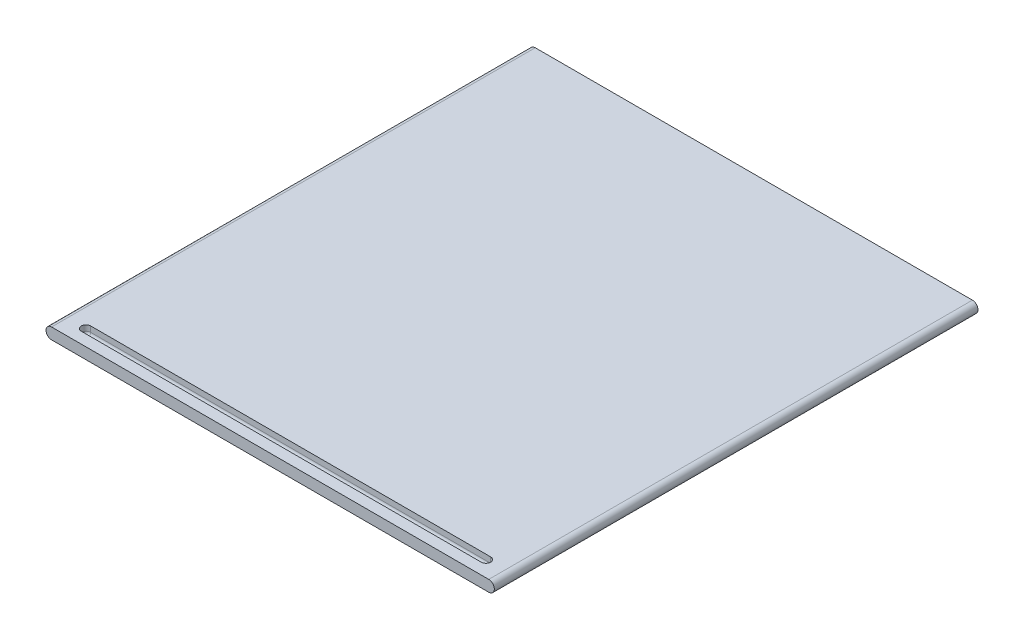
ISO-10303-21;
HEADER;
FILE_DESCRIPTION(('STEP AP214'),'2;1');
FILE_NAME('part.step','',(''),(''),'','','');
FILE_SCHEMA(('AUTOMOTIVE_DESIGN { 1 0 10303 214 1 1 1 1 }'));
ENDSEC;
DATA;
#1=APPLICATION_CONTEXT('core data for automotive mechanical design processes');
#2=APPLICATION_PROTOCOL_DEFINITION('international standard','automotive_design',2000,#1);
#3=PRODUCT_CONTEXT('',#1,'mechanical');
#4=PRODUCT('Part','Part','',(#3));
#5=PRODUCT_RELATED_PRODUCT_CATEGORY('part','',(#4));
#6=PRODUCT_DEFINITION_FORMATION('','',#4);
#7=PRODUCT_DEFINITION_CONTEXT('part definition',#1,'design');
#8=PRODUCT_DEFINITION('design','',#6,#7);
#9=PRODUCT_DEFINITION_SHAPE('','',#8);
#10=(LENGTH_UNIT() NAMED_UNIT(*) SI_UNIT(.MILLI.,.METRE.));
#11=(NAMED_UNIT(*) PLANE_ANGLE_UNIT() SI_UNIT($,.RADIAN.));
#12=(NAMED_UNIT(*) SI_UNIT($,.STERADIAN.) SOLID_ANGLE_UNIT());
#13=UNCERTAINTY_MEASURE_WITH_UNIT(LENGTH_MEASURE(1.E-05),#10,'distance_accuracy_value','');
#14=(GEOMETRIC_REPRESENTATION_CONTEXT(3) GLOBAL_UNCERTAINTY_ASSIGNED_CONTEXT((#13)) GLOBAL_UNIT_ASSIGNED_CONTEXT((#10,
#11,#12)) REPRESENTATION_CONTEXT('',''));
#15=CARTESIAN_POINT('',(0.,0.,0.));
#16=DIRECTION('',(0.,0.,1.));
#17=DIRECTION('',(1.,0.,0.));
#18=AXIS2_PLACEMENT_3D('',#15,#16,#17);
#19=CARTESIAN_POINT('',(-23.5,0.,52.));
#20=DIRECTION('',(0.,0.,-1.));
#21=DIRECTION('',(-1.,0.,0.));
#22=AXIS2_PLACEMENT_3D('',#19,#20,#21);
#23=CYLINDRICAL_SURFACE('',#22,0.6);
#24=CARTESIAN_POINT('',(-23.5,0.,0.));
#25=DIRECTION('',(0.,0.,1.));
#26=DIRECTION('',(1.,0.,0.));
#27=AXIS2_PLACEMENT_3D('',#24,#25,#26);
#28=CIRCLE('',#27,0.6);
#29=CARTESIAN_POINT('',(-23.5,0.6,0.));
#30=VERTEX_POINT('',#29);
#31=CARTESIAN_POINT('',(-23.5,-0.6,0.));
#32=VERTEX_POINT('',#31);
#33=EDGE_CURVE('E149',#30,#32,#28,.T.);
#34=ORIENTED_EDGE('',*,*,#33,.T.);
#35=DIRECTION('',(0.,0.,-1.));
#36=VECTOR('',#35,1.);
#37=CARTESIAN_POINT('',(-23.5,-0.6,52.));
#38=LINE('',#37,#36);
#39=CARTESIAN_POINT('',(-23.5,-0.6,52.));
#40=VERTEX_POINT('',#39);
#41=EDGE_CURVE('E178',#40,#32,#38,.T.);
#42=ORIENTED_EDGE('',*,*,#41,.F.);
#43=CARTESIAN_POINT('',(-23.5,0.,52.));
#44=DIRECTION('',(0.,0.,1.));
#45=DIRECTION('',(1.,0.,0.));
#46=AXIS2_PLACEMENT_3D('',#43,#44,#45);
#47=CIRCLE('',#46,0.6);
#48=CARTESIAN_POINT('',(-23.5,0.6,52.));
#49=VERTEX_POINT('',#48);
#50=EDGE_CURVE('E152',#49,#40,#47,.T.);
#51=ORIENTED_EDGE('',*,*,#50,.F.);
#52=DIRECTION('',(0.,0.,-1.));
#53=VECTOR('',#52,1.);
#54=CARTESIAN_POINT('',(-23.5,0.6,52.));
#55=LINE('',#54,#53);
#56=EDGE_CURVE('E162',#49,#30,#55,.T.);
#57=ORIENTED_EDGE('',*,*,#56,.T.);
#58=EDGE_LOOP('',(#34,#42,#51,#57));
#59=FACE_BOUND('',#58,.T.);
#60=ADVANCED_FACE('F41',(#59),#23,.T.);
#61=CARTESIAN_POINT('',(-23.5,-0.6,52.));
#62=DIRECTION('',(0.,1.,0.));
#63=DIRECTION('',(-1.,0.,0.));
#64=AXIS2_PLACEMENT_3D('',#61,#62,#63);
#65=PLANE('',#64);
#66=DIRECTION('',(1.,0.,0.));
#67=VECTOR('',#66,1.);
#68=CARTESIAN_POINT('',(-23.5,-0.6,0.));
#69=LINE('',#68,#67);
#70=CARTESIAN_POINT('',(23.5,-0.599999999999991,0.));
#71=VERTEX_POINT('',#70);
#72=EDGE_CURVE('E165',#32,#71,#69,.T.);
#73=ORIENTED_EDGE('',*,*,#72,.T.);
#74=DIRECTION('',(0.,0.,-1.));
#75=VECTOR('',#74,1.);
#76=CARTESIAN_POINT('',(23.5,-0.599999999999991,52.));
#77=LINE('',#76,#75);
#78=CARTESIAN_POINT('',(23.5,-0.599999999999991,52.));
#79=VERTEX_POINT('',#78);
#80=EDGE_CURVE('E175',#79,#71,#77,.T.);
#81=ORIENTED_EDGE('',*,*,#80,.F.);
#82=DIRECTION('',(1.,0.,0.));
#83=VECTOR('',#82,1.);
#84=CARTESIAN_POINT('',(-23.5,-0.6,52.));
#85=LINE('',#84,#83);
#86=EDGE_CURVE('E155',#40,#79,#85,.T.);
#87=ORIENTED_EDGE('',*,*,#86,.F.);
#88=ORIENTED_EDGE('',*,*,#41,.T.);
#89=EDGE_LOOP('',(#73,#81,#87,#88));
#90=FACE_BOUND('',#89,.T.);
#91=ADVANCED_FACE('F227',(#90),#65,.F.);
#92=CARTESIAN_POINT('',(23.5,0.,52.));
#93=DIRECTION('',(0.,0.,-1.));
#94=DIRECTION('',(-1.,0.,0.));
#95=AXIS2_PLACEMENT_3D('',#92,#93,#94);
#96=CYLINDRICAL_SURFACE('',#95,0.6);
#97=CARTESIAN_POINT('',(23.5,0.,0.));
#98=DIRECTION('',(0.,0.,1.));
#99=DIRECTION('',(1.,0.,0.));
#100=AXIS2_PLACEMENT_3D('',#97,#98,#99);
#101=CIRCLE('',#100,0.6);
#102=CARTESIAN_POINT('',(23.5,0.600000000000009,0.));
#103=VERTEX_POINT('',#102);
#104=EDGE_CURVE('E167',#71,#103,#101,.T.);
#105=ORIENTED_EDGE('',*,*,#104,.T.);
#106=DIRECTION('',(0.,0.,-1.));
#107=VECTOR('',#106,1.);
#108=CARTESIAN_POINT('',(23.5,0.600000000000009,52.));
#109=LINE('',#108,#107);
#110=CARTESIAN_POINT('',(23.5,0.600000000000009,52.));
#111=VERTEX_POINT('',#110);
#112=EDGE_CURVE('E172',#111,#103,#109,.T.);
#113=ORIENTED_EDGE('',*,*,#112,.F.);
#114=CARTESIAN_POINT('',(23.5,0.,52.));
#115=DIRECTION('',(0.,0.,1.));
#116=DIRECTION('',(1.,0.,0.));
#117=AXIS2_PLACEMENT_3D('',#114,#115,#116);
#118=CIRCLE('',#117,0.6);
#119=EDGE_CURVE('E158',#79,#111,#118,.T.);
#120=ORIENTED_EDGE('',*,*,#119,.F.);
#121=ORIENTED_EDGE('',*,*,#80,.T.);
#122=EDGE_LOOP('',(#105,#113,#120,#121));
#123=FACE_BOUND('',#122,.T.);
#124=ADVANCED_FACE('F233',(#123),#96,.T.);
#125=CARTESIAN_POINT('',(-23.5,0.6,52.));
#126=DIRECTION('',(0.,-1.,0.));
#127=DIRECTION('',(1.,0.,0.));
#128=AXIS2_PLACEMENT_3D('',#125,#126,#127);
#129=PLANE('',#128);
#130=DIRECTION('',(1.,0.,0.));
#131=VECTOR('',#130,1.);
#132=CARTESIAN_POINT('',(-21.5,0.600000000000001,50.8));
#133=LINE('',#132,#131);
#134=CARTESIAN_POINT('',(-21.5,0.6,50.8));
#135=VERTEX_POINT('',#134);
#136=CARTESIAN_POINT('',(21.5,0.600000000000008,50.8));
#137=VERTEX_POINT('',#136);
#138=EDGE_CURVE('E132',#135,#137,#133,.T.);
#139=ORIENTED_EDGE('',*,*,#138,.F.);
#140=CARTESIAN_POINT('',(-21.5,0.600000000000001,50.3));
#141=DIRECTION('',(0.,1.,0.));
#142=DIRECTION('',(-1.,0.,0.));
#143=AXIS2_PLACEMENT_3D('',#140,#141,#142);
#144=CIRCLE('',#143,0.499999999999994);
#145=CARTESIAN_POINT('',(-21.5,0.600000000000001,49.8));
#146=VERTEX_POINT('',#145);
#147=EDGE_CURVE('E137',#146,#135,#144,.T.);
#148=ORIENTED_EDGE('',*,*,#147,.F.);
#149=DIRECTION('',(-1.,0.,0.));
#150=VECTOR('',#149,1.);
#151=CARTESIAN_POINT('',(-21.5,0.600000000000001,49.8));
#152=LINE('',#151,#150);
#153=CARTESIAN_POINT('',(21.5,0.600000000000008,49.8));
#154=VERTEX_POINT('',#153);
#155=EDGE_CURVE('E142',#154,#146,#152,.T.);
#156=ORIENTED_EDGE('',*,*,#155,.F.);
#157=CARTESIAN_POINT('',(21.5,0.600000000000008,50.3));
#158=DIRECTION('',(0.,1.,0.));
#159=DIRECTION('',(-1.,0.,0.));
#160=AXIS2_PLACEMENT_3D('',#157,#158,#159);
#161=CIRCLE('',#160,0.5);
#162=EDGE_CURVE('E124',#137,#154,#161,.T.);
#163=ORIENTED_EDGE('',*,*,#162,.F.);
#164=EDGE_LOOP('',(#139,#148,#156,#163));
#165=FACE_BOUND('',#164,.T.);
#166=DIRECTION('',(-1.,0.,0.));
#167=VECTOR('',#166,1.);
#168=CARTESIAN_POINT('',(-23.5,0.6,0.));
#169=LINE('',#168,#167);
#170=EDGE_CURVE('E156',#103,#30,#169,.T.);
#171=ORIENTED_EDGE('',*,*,#170,.T.);
#172=ORIENTED_EDGE('',*,*,#56,.F.);
#173=DIRECTION('',(-1.,0.,0.));
#174=VECTOR('',#173,1.);
#175=CARTESIAN_POINT('',(-23.5,0.6,52.));
#176=LINE('',#175,#174);
#177=EDGE_CURVE('E160',#111,#49,#176,.T.);
#178=ORIENTED_EDGE('',*,*,#177,.F.);
#179=ORIENTED_EDGE('',*,*,#112,.T.);
#180=EDGE_LOOP('',(#171,#172,#178,#179));
#181=FACE_BOUND('',#180,.T.);
#182=ADVANCED_FACE('F139',(#165,#181),#129,.F.);
#183=CARTESIAN_POINT('',(-23.5,0.,52.));
#184=DIRECTION('',(0.,0.,1.));
#185=DIRECTION('',(1.,0.,0.));
#186=AXIS2_PLACEMENT_3D('',#183,#184,#185);
#187=PLANE('',#186);
#188=ORIENTED_EDGE('',*,*,#50,.T.);
#189=ORIENTED_EDGE('',*,*,#86,.T.);
#190=ORIENTED_EDGE('',*,*,#119,.T.);
#191=ORIENTED_EDGE('',*,*,#177,.T.);
#192=EDGE_LOOP('',(#188,#189,#190,#191));
#193=FACE_BOUND('',#192,.T.);
#194=ADVANCED_FACE('F308',(#193),#187,.T.);
#195=CARTESIAN_POINT('',(-23.5,0.,0.));
#196=DIRECTION('',(0.,0.,1.));
#197=DIRECTION('',(1.,0.,0.));
#198=AXIS2_PLACEMENT_3D('',#195,#196,#197);
#199=PLANE('',#198);
#200=ORIENTED_EDGE('',*,*,#33,.F.);
#201=ORIENTED_EDGE('',*,*,#170,.F.);
#202=ORIENTED_EDGE('',*,*,#104,.F.);
#203=ORIENTED_EDGE('',*,*,#72,.F.);
#204=EDGE_LOOP('',(#200,#201,#202,#203));
#205=FACE_BOUND('',#204,.T.);
#206=ADVANCED_FACE('F298',(#205),#199,.F.);
#207=CARTESIAN_POINT('',(-21.5,-0.4,50.3));
#208=DIRECTION('',(0.,1.,0.));
#209=DIRECTION('',(-1.,0.,0.));
#210=AXIS2_PLACEMENT_3D('',#207,#208,#209);
#211=CYLINDRICAL_SURFACE('',#210,0.499999999999994);
#212=DIRECTION('',(0.,1.,0.));
#213=VECTOR('',#212,1.);
#214=CARTESIAN_POINT('',(-21.5,-0.4,50.8));
#215=LINE('',#214,#213);
#216=CARTESIAN_POINT('',(-21.5,0.,50.8));
#217=VERTEX_POINT('',#216);
#218=EDGE_CURVE('E129',#217,#135,#215,.T.);
#219=ORIENTED_EDGE('',*,*,#218,.F.);
#220=CARTESIAN_POINT('',(-21.5,0.,50.3));
#221=DIRECTION('',(0.,1.,0.));
#222=DIRECTION('',(-1.,0.,0.));
#223=AXIS2_PLACEMENT_3D('',#220,#221,#222);
#224=CIRCLE('',#223,0.499999999999994);
#225=CARTESIAN_POINT('',(-21.5,0.,49.8));
#226=VERTEX_POINT('',#225);
#227=EDGE_CURVE('E50',#217,#226,#224,.F.);
#228=ORIENTED_EDGE('',*,*,#227,.T.);
#229=DIRECTION('',(0.,1.,0.));
#230=VECTOR('',#229,1.);
#231=CARTESIAN_POINT('',(-21.5,-0.4,49.8));
#232=LINE('',#231,#230);
#233=EDGE_CURVE('E147',#226,#146,#232,.T.);
#234=ORIENTED_EDGE('',*,*,#233,.T.);
#235=ORIENTED_EDGE('',*,*,#147,.T.);
#236=EDGE_LOOP('',(#219,#228,#234,#235));
#237=FACE_BOUND('',#236,.T.);
#238=ADVANCED_FACE('F206',(#237),#211,.F.);
#239=CARTESIAN_POINT('',(-21.5,-0.4,49.8));
#240=DIRECTION('',(0.,0.,-1.));
#241=DIRECTION('',(-1.,0.,0.));
#242=AXIS2_PLACEMENT_3D('',#239,#240,#241);
#243=PLANE('',#242);
#244=ORIENTED_EDGE('',*,*,#233,.F.);
#245=DIRECTION('',(-1.,0.,0.));
#246=VECTOR('',#245,1.);
#247=CARTESIAN_POINT('',(-21.5,0.,49.8));
#248=LINE('',#247,#246);
#249=CARTESIAN_POINT('',(21.5,0.,49.8));
#250=VERTEX_POINT('',#249);
#251=EDGE_CURVE('E11',#226,#250,#248,.F.);
#252=ORIENTED_EDGE('',*,*,#251,.T.);
#253=DIRECTION('',(0.,1.,0.));
#254=VECTOR('',#253,1.);
#255=CARTESIAN_POINT('',(21.5,-0.399999999999992,49.8));
#256=LINE('',#255,#254);
#257=EDGE_CURVE('E128',#250,#154,#256,.T.);
#258=ORIENTED_EDGE('',*,*,#257,.T.);
#259=ORIENTED_EDGE('',*,*,#155,.T.);
#260=EDGE_LOOP('',(#244,#252,#258,#259));
#261=FACE_BOUND('',#260,.T.);
#262=ADVANCED_FACE('F208',(#261),#243,.F.);
#263=CARTESIAN_POINT('',(21.5,-0.399999999999992,50.3));
#264=DIRECTION('',(0.,1.,0.));
#265=DIRECTION('',(-1.,0.,0.));
#266=AXIS2_PLACEMENT_3D('',#263,#264,#265);
#267=CYLINDRICAL_SURFACE('',#266,0.5);
#268=ORIENTED_EDGE('',*,*,#257,.F.);
#269=CARTESIAN_POINT('',(21.5,0.,50.3));
#270=DIRECTION('',(0.,1.,0.));
#271=DIRECTION('',(-1.,0.,0.));
#272=AXIS2_PLACEMENT_3D('',#269,#270,#271);
#273=CIRCLE('',#272,0.5);
#274=CARTESIAN_POINT('',(21.5,0.,50.8));
#275=VERTEX_POINT('',#274);
#276=EDGE_CURVE('E127',#250,#275,#273,.F.);
#277=ORIENTED_EDGE('',*,*,#276,.T.);
#278=DIRECTION('',(0.,1.,0.));
#279=VECTOR('',#278,1.);
#280=CARTESIAN_POINT('',(21.5,-0.399999999999992,50.8));
#281=LINE('',#280,#279);
#282=EDGE_CURVE('E119',#275,#137,#281,.T.);
#283=ORIENTED_EDGE('',*,*,#282,.T.);
#284=ORIENTED_EDGE('',*,*,#162,.T.);
#285=EDGE_LOOP('',(#268,#277,#283,#284));
#286=FACE_BOUND('',#285,.T.);
#287=ADVANCED_FACE('F122',(#286),#267,.F.);
#288=CARTESIAN_POINT('',(-21.5,-0.4,50.8));
#289=DIRECTION('',(0.,0.,1.));
#290=DIRECTION('',(1.,0.,0.));
#291=AXIS2_PLACEMENT_3D('',#288,#289,#290);
#292=PLANE('',#291);
#293=ORIENTED_EDGE('',*,*,#282,.F.);
#294=DIRECTION('',(1.,0.,0.));
#295=VECTOR('',#294,1.);
#296=CARTESIAN_POINT('',(-21.5,0.,50.8));
#297=LINE('',#296,#295);
#298=EDGE_CURVE('E65',#275,#217,#297,.F.);
#299=ORIENTED_EDGE('',*,*,#298,.T.);
#300=ORIENTED_EDGE('',*,*,#218,.T.);
#301=ORIENTED_EDGE('',*,*,#138,.T.);
#302=EDGE_LOOP('',(#293,#299,#300,#301));
#303=FACE_BOUND('',#302,.T.);
#304=ADVANCED_FACE('F133',(#303),#292,.F.);
#305=CARTESIAN_POINT('',(-21.5,-0.4,50.3));
#306=DIRECTION('',(0.,1.,0.));
#307=DIRECTION('',(-1.,0.,0.));
#308=AXIS2_PLACEMENT_3D('',#305,#306,#307);
#309=PLANE('',#308);
#310=DIRECTION('',(1.,0.,0.));
#311=VECTOR('',#310,1.);
#312=CARTESIAN_POINT('',(-21.5,-0.4,50.4));
#313=LINE('',#312,#311);
#314=CARTESIAN_POINT('',(-21.5,-0.4,50.4));
#315=VERTEX_POINT('',#314);
#316=CARTESIAN_POINT('',(21.5,-0.399999999999992,50.4));
#317=VERTEX_POINT('',#316);
#318=EDGE_CURVE('E185',#315,#317,#313,.T.);
#319=ORIENTED_EDGE('',*,*,#318,.T.);
#320=CARTESIAN_POINT('',(21.5,-0.399999999999992,50.3));
#321=DIRECTION('',(0.,1.,0.));
#322=DIRECTION('',(-1.,0.,0.));
#323=AXIS2_PLACEMENT_3D('',#320,#321,#322);
#324=CIRCLE('',#323,0.1);
#325=CARTESIAN_POINT('',(21.5,-0.399999999999992,50.2));
#326=VERTEX_POINT('',#325);
#327=EDGE_CURVE('E187',#317,#326,#324,.T.);
#328=ORIENTED_EDGE('',*,*,#327,.T.);
#329=DIRECTION('',(-1.,0.,0.));
#330=VECTOR('',#329,1.);
#331=CARTESIAN_POINT('',(-21.5,-0.4,50.2));
#332=LINE('',#331,#330);
#333=CARTESIAN_POINT('',(-21.5,-0.4,50.2));
#334=VERTEX_POINT('',#333);
#335=EDGE_CURVE('E181',#326,#334,#332,.T.);
#336=ORIENTED_EDGE('',*,*,#335,.T.);
#337=CARTESIAN_POINT('',(-21.5,-0.4,50.3));
#338=DIRECTION('',(0.,1.,0.));
#339=DIRECTION('',(-1.,0.,0.));
#340=AXIS2_PLACEMENT_3D('',#337,#338,#339);
#341=CIRCLE('',#340,0.0999999999999935);
#342=EDGE_CURVE('E183',#334,#315,#341,.T.);
#343=ORIENTED_EDGE('',*,*,#342,.T.);
#344=EDGE_LOOP('',(#319,#328,#336,#343));
#345=FACE_BOUND('',#344,.T.);
#346=ADVANCED_FACE('F217',(#345),#309,.T.);
#347=CARTESIAN_POINT('',(-21.5,0.,50.3));
#348=DIRECTION('',(0.,1.,0.));
#349=DIRECTION('',(-1.,0.,0.));
#350=AXIS2_PLACEMENT_3D('',#347,#348,#349);
#351=DEGENERATE_TOROIDAL_SURFACE('',#350,0.0999999999999935,0.4,.T.);
#352=CARTESIAN_POINT('',(-21.5,0.,50.2));
#353=DIRECTION('',(-1.,0.,0.));
#354=DIRECTION('',(0.,0.,1.));
#355=AXIS2_PLACEMENT_3D('',#352,#353,#354);
#356=CIRCLE('',#355,0.4);
#357=EDGE_CURVE('E196',#226,#334,#356,.T.);
#358=ORIENTED_EDGE('',*,*,#357,.F.);
#359=ORIENTED_EDGE('',*,*,#227,.F.);
#360=CARTESIAN_POINT('',(-21.5,0.,50.4));
#361=DIRECTION('',(-1.,0.,0.));
#362=DIRECTION('',(0.,0.,1.));
#363=AXIS2_PLACEMENT_3D('',#360,#361,#362);
#364=CIRCLE('',#363,0.4);
#365=EDGE_CURVE('E45',#315,#217,#364,.T.);
#366=ORIENTED_EDGE('',*,*,#365,.F.);
#367=ORIENTED_EDGE('',*,*,#342,.F.);
#368=EDGE_LOOP('',(#358,#359,#366,#367));
#369=FACE_BOUND('',#368,.T.);
#370=ADVANCED_FACE('F43',(#369),#351,.F.);
#371=CARTESIAN_POINT('',(-21.5,0.,50.4));
#372=DIRECTION('',(1.,0.,0.));
#373=DIRECTION('',(0.,1.,0.));
#374=AXIS2_PLACEMENT_3D('',#371,#372,#373);
#375=CYLINDRICAL_SURFACE('',#374,0.4);
#376=ORIENTED_EDGE('',*,*,#365,.T.);
#377=ORIENTED_EDGE('',*,*,#298,.F.);
#378=CARTESIAN_POINT('',(21.5,0.,50.4));
#379=DIRECTION('',(-1.,0.,0.));
#380=DIRECTION('',(0.,0.,1.));
#381=AXIS2_PLACEMENT_3D('',#378,#379,#380);
#382=CIRCLE('',#381,0.4);
#383=EDGE_CURVE('E195',#317,#275,#382,.T.);
#384=ORIENTED_EDGE('',*,*,#383,.F.);
#385=ORIENTED_EDGE('',*,*,#318,.F.);
#386=EDGE_LOOP('',(#376,#377,#384,#385));
#387=FACE_BOUND('',#386,.T.);
#388=ADVANCED_FACE('F218',(#387),#375,.F.);
#389=CARTESIAN_POINT('',(-21.5,0.,50.2));
#390=DIRECTION('',(-1.,0.,0.));
#391=DIRECTION('',(0.,-1.,0.));
#392=AXIS2_PLACEMENT_3D('',#389,#390,#391);
#393=CYLINDRICAL_SURFACE('',#392,0.4);
#394=ORIENTED_EDGE('',*,*,#357,.T.);
#395=ORIENTED_EDGE('',*,*,#335,.F.);
#396=CARTESIAN_POINT('',(21.5,0.,50.2));
#397=DIRECTION('',(-1.,0.,0.));
#398=DIRECTION('',(0.,0.,1.));
#399=AXIS2_PLACEMENT_3D('',#396,#397,#398);
#400=CIRCLE('',#399,0.4);
#401=EDGE_CURVE('E193',#250,#326,#400,.T.);
#402=ORIENTED_EDGE('',*,*,#401,.F.);
#403=ORIENTED_EDGE('',*,*,#251,.F.);
#404=EDGE_LOOP('',(#394,#395,#402,#403));
#405=FACE_BOUND('',#404,.T.);
#406=ADVANCED_FACE('F214',(#405),#393,.F.);
#407=CARTESIAN_POINT('',(21.5,0.,50.3));
#408=DIRECTION('',(0.,1.,0.));
#409=DIRECTION('',(-1.,0.,0.));
#410=AXIS2_PLACEMENT_3D('',#407,#408,#409);
#411=DEGENERATE_TOROIDAL_SURFACE('',#410,0.1,0.4,.T.);
#412=ORIENTED_EDGE('',*,*,#383,.T.);
#413=ORIENTED_EDGE('',*,*,#276,.F.);
#414=ORIENTED_EDGE('',*,*,#401,.T.);
#415=ORIENTED_EDGE('',*,*,#327,.F.);
#416=EDGE_LOOP('',(#412,#413,#414,#415));
#417=FACE_BOUND('',#416,.T.);
#418=ADVANCED_FACE('F211',(#417),#411,.F.);
#419=CLOSED_SHELL('',(#60,#91,#124,#182,#194,#206,#238,#262,#287,#304,#346,#370,#388,#406,#418));
#420=MANIFOLD_SOLID_BREP('B2',#419);
#421=ADVANCED_BREP_SHAPE_REPRESENTATION('',(#18,#420),#14);
#422=SHAPE_DEFINITION_REPRESENTATION(#9,#421);
ENDSEC;
END-ISO-10303-21;
